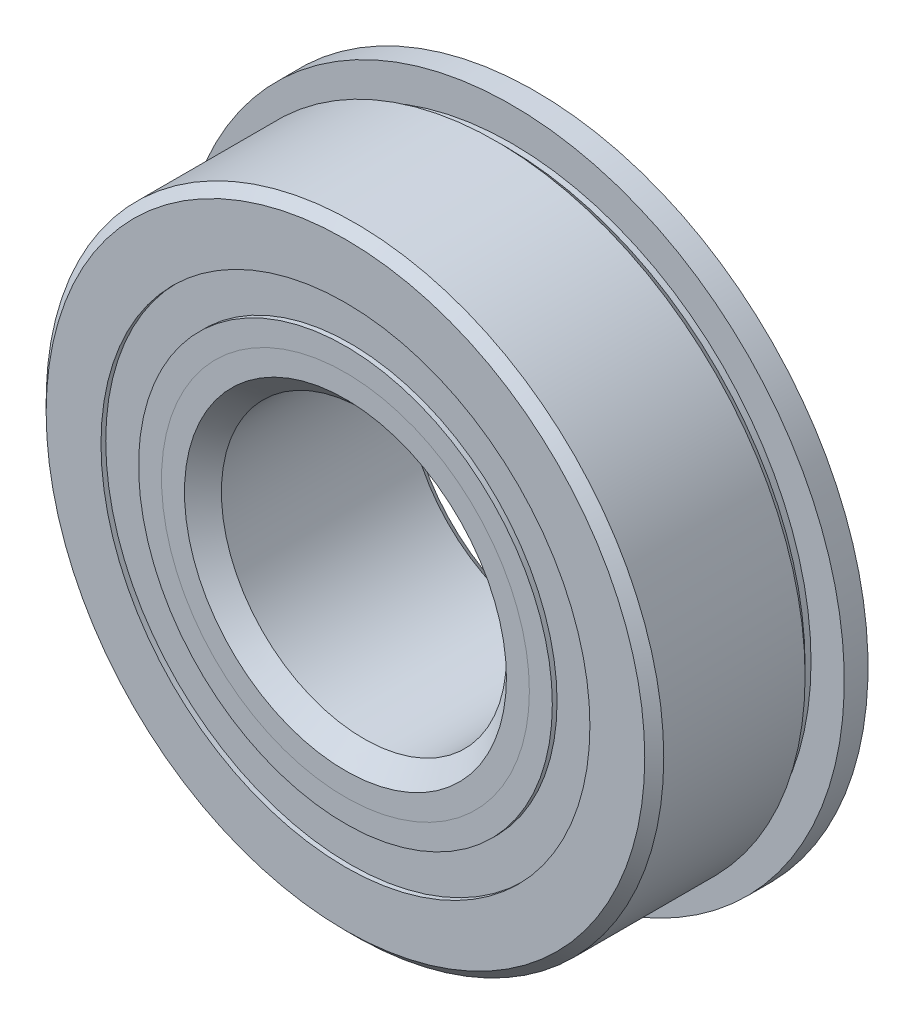
ISO-10303-21;
HEADER;
FILE_DESCRIPTION(('STEP AP214'),'2;1');
FILE_NAME('part.step','',(''),(''),'','','');
FILE_SCHEMA(('AUTOMOTIVE_DESIGN { 1 0 10303 214 1 1 1 1 }'));
ENDSEC;
DATA;
#1=APPLICATION_CONTEXT('core data for automotive mechanical design processes');
#2=APPLICATION_PROTOCOL_DEFINITION('international standard','automotive_design',2000,#1);
#3=PRODUCT_CONTEXT('',#1,'mechanical');
#4=PRODUCT('Part','Part','',(#3));
#5=PRODUCT_RELATED_PRODUCT_CATEGORY('part','',(#4));
#6=PRODUCT_DEFINITION_FORMATION('','',#4);
#7=PRODUCT_DEFINITION_CONTEXT('part definition',#1,'design');
#8=PRODUCT_DEFINITION('design','',#6,#7);
#9=PRODUCT_DEFINITION_SHAPE('','',#8);
#10=(LENGTH_UNIT() NAMED_UNIT(*) SI_UNIT(.MILLI.,.METRE.));
#11=(NAMED_UNIT(*) PLANE_ANGLE_UNIT() SI_UNIT($,.RADIAN.));
#12=(NAMED_UNIT(*) SI_UNIT($,.STERADIAN.) SOLID_ANGLE_UNIT());
#13=UNCERTAINTY_MEASURE_WITH_UNIT(LENGTH_MEASURE(1.E-05),#10,'distance_accuracy_value','');
#14=(GEOMETRIC_REPRESENTATION_CONTEXT(3) GLOBAL_UNCERTAINTY_ASSIGNED_CONTEXT((#13)) GLOBAL_UNIT_ASSIGNED_CONTEXT((#10,
#11,#12)) REPRESENTATION_CONTEXT('',''));
#15=CARTESIAN_POINT('',(0.,0.,0.));
#16=DIRECTION('',(0.,0.,1.));
#17=DIRECTION('',(1.,0.,0.));
#18=AXIS2_PLACEMENT_3D('',#15,#16,#17);
#19=CARTESIAN_POINT('',(0.,16.337293956044,-6.0325));
#20=DIRECTION('',(0.,0.,1.));
#21=DIRECTION('',(1.,0.,0.));
#22=AXIS2_PLACEMENT_3D('',#19,#20,#21);
#23=PLANE('',#22);
#24=CARTESIAN_POINT('',(0.,0.,-6.0325));
#25=DIRECTION('',(0.,0.,1.));
#26=DIRECTION('',(1.,0.,0.));
#27=AXIS2_PLACEMENT_3D('',#24,#25,#26);
#28=CIRCLE('',#27,16.337293956044);
#29=CARTESIAN_POINT('',(16.337293956044,0.,-6.0325));
#30=VERTEX_POINT('',#29);
#31=EDGE_CURVE('E57',#30,#30,#28,.T.);
#32=ORIENTED_EDGE('',*,*,#31,.F.);
#33=EDGE_LOOP('',(#32));
#34=FACE_BOUND('',#33,.T.);
#35=CARTESIAN_POINT('',(0.,0.,-6.0325));
#36=DIRECTION('',(0.,0.,1.));
#37=DIRECTION('',(1.,0.,0.));
#38=AXIS2_PLACEMENT_3D('',#35,#36,#37);
#39=CIRCLE('',#38,13.825206043956);
#40=CARTESIAN_POINT('',(13.825206043956,0.,-6.0325));
#41=VERTEX_POINT('',#40);
#42=EDGE_CURVE('E11',#41,#41,#39,.T.);
#43=ORIENTED_EDGE('',*,*,#42,.T.);
#44=EDGE_LOOP('',(#43));
#45=FACE_BOUND('',#44,.T.);
#46=ADVANCED_FACE('F43',(#34,#45),#23,.F.);
#47=CARTESIAN_POINT('',(0.,0.,6.35));
#48=DIRECTION('',(0.,0.,1.));
#49=DIRECTION('',(1.,0.,0.));
#50=AXIS2_PLACEMENT_3D('',#47,#48,#49);
#51=CYLINDRICAL_SURFACE('',#50,13.825206043956);
#52=ORIENTED_EDGE('',*,*,#42,.F.);
#53=EDGE_LOOP('',(#52));
#54=FACE_BOUND('',#53,.T.);
#55=CARTESIAN_POINT('',(0.,0.,-3.08910742628344));
#56=DIRECTION('',(0.,0.,1.));
#57=DIRECTION('',(1.,0.,0.));
#58=AXIS2_PLACEMENT_3D('',#55,#56,#57);
#59=CIRCLE('',#58,13.825206043956);
#60=CARTESIAN_POINT('',(13.825206043956,0.,-3.08910742628344));
#61=VERTEX_POINT('',#60);
#62=EDGE_CURVE('E49',#61,#61,#59,.T.);
#63=ORIENTED_EDGE('',*,*,#62,.T.);
#64=EDGE_LOOP('',(#63));
#65=FACE_BOUND('',#64,.T.);
#66=ADVANCED_FACE('F66',(#54,#65),#51,.F.);
#67=CARTESIAN_POINT('',(0.,16.337293956044,-3.08910742628344));
#68=DIRECTION('',(0.,0.,-1.));
#69=DIRECTION('',(-1.,0.,0.));
#70=AXIS2_PLACEMENT_3D('',#67,#68,#69);
#71=PLANE('',#70);
#72=ORIENTED_EDGE('',*,*,#62,.F.);
#73=EDGE_LOOP('',(#72));
#74=FACE_BOUND('',#73,.T.);
#75=CARTESIAN_POINT('',(0.,0.,-3.08910742628344));
#76=DIRECTION('',(0.,0.,1.));
#77=DIRECTION('',(1.,0.,0.));
#78=AXIS2_PLACEMENT_3D('',#75,#76,#77);
#79=CIRCLE('',#78,16.337293956044);
#80=CARTESIAN_POINT('',(16.337293956044,0.,-3.08910742628344));
#81=VERTEX_POINT('',#80);
#82=EDGE_CURVE('E53',#81,#81,#79,.T.);
#83=ORIENTED_EDGE('',*,*,#82,.T.);
#84=EDGE_LOOP('',(#83));
#85=FACE_BOUND('',#84,.T.);
#86=ADVANCED_FACE('F70',(#74,#85),#71,.F.);
#87=CARTESIAN_POINT('',(0.,0.,6.35));
#88=DIRECTION('',(0.,0.,1.));
#89=DIRECTION('',(1.,0.,0.));
#90=AXIS2_PLACEMENT_3D('',#87,#88,#89);
#91=CYLINDRICAL_SURFACE('',#90,16.337293956044);
#92=ORIENTED_EDGE('',*,*,#82,.F.);
#93=EDGE_LOOP('',(#92));
#94=FACE_BOUND('',#93,.T.);
#95=ORIENTED_EDGE('',*,*,#31,.T.);
#96=EDGE_LOOP('',(#95));
#97=FACE_BOUND('',#96,.T.);
#98=ADVANCED_FACE('F63',(#94,#97),#91,.T.);
#99=CLOSED_SHELL('',(#46,#66,#86,#98));
#100=MANIFOLD_SOLID_BREP('B2',#99);
#101=CARTESIAN_POINT('',(0.,16.337293956044,6.0325));
#102=DIRECTION('',(0.,0.,-1.));
#103=DIRECTION('',(-1.,0.,0.));
#104=AXIS2_PLACEMENT_3D('',#101,#102,#103);
#105=PLANE('',#104);
#106=CARTESIAN_POINT('',(0.,0.,6.0325));
#107=DIRECTION('',(0.,0.,1.));
#108=DIRECTION('',(1.,0.,0.));
#109=AXIS2_PLACEMENT_3D('',#106,#107,#108);
#110=CIRCLE('',#109,13.825206043956);
#111=CARTESIAN_POINT('',(13.825206043956,0.,6.0325));
#112=VERTEX_POINT('',#111);
#113=EDGE_CURVE('E42',#112,#112,#110,.T.);
#114=ORIENTED_EDGE('',*,*,#113,.F.);
#115=EDGE_LOOP('',(#114));
#116=FACE_BOUND('',#115,.T.);
#117=CARTESIAN_POINT('',(0.,0.,6.0325));
#118=DIRECTION('',(0.,0.,1.));
#119=DIRECTION('',(1.,0.,0.));
#120=AXIS2_PLACEMENT_3D('',#117,#118,#119);
#121=CIRCLE('',#120,16.337293956044);
#122=CARTESIAN_POINT('',(16.337293956044,0.,6.0325));
#123=VERTEX_POINT('',#122);
#124=EDGE_CURVE('E124',#123,#123,#121,.T.);
#125=ORIENTED_EDGE('',*,*,#124,.T.);
#126=EDGE_LOOP('',(#125));
#127=FACE_BOUND('',#126,.T.);
#128=ADVANCED_FACE('F110',(#116,#127),#105,.F.);
#129=CARTESIAN_POINT('',(0.,0.,6.35));
#130=DIRECTION('',(0.,0.,1.));
#131=DIRECTION('',(1.,0.,0.));
#132=AXIS2_PLACEMENT_3D('',#129,#130,#131);
#133=CYLINDRICAL_SURFACE('',#132,13.825206043956);
#134=CARTESIAN_POINT('',(0.,0.,3.08910742628344));
#135=DIRECTION('',(0.,0.,1.));
#136=DIRECTION('',(1.,0.,0.));
#137=AXIS2_PLACEMENT_3D('',#134,#135,#136);
#138=CIRCLE('',#137,13.825206043956);
#139=CARTESIAN_POINT('',(13.825206043956,0.,3.08910742628344));
#140=VERTEX_POINT('',#139);
#141=EDGE_CURVE('E116',#140,#140,#138,.T.);
#142=ORIENTED_EDGE('',*,*,#141,.F.);
#143=EDGE_LOOP('',(#142));
#144=FACE_BOUND('',#143,.T.);
#145=ORIENTED_EDGE('',*,*,#113,.T.);
#146=EDGE_LOOP('',(#145));
#147=FACE_BOUND('',#146,.T.);
#148=ADVANCED_FACE('F139',(#144,#147),#133,.F.);
#149=CARTESIAN_POINT('',(0.,16.337293956044,3.08910742628344));
#150=DIRECTION('',(0.,0.,1.));
#151=DIRECTION('',(1.,0.,0.));
#152=AXIS2_PLACEMENT_3D('',#149,#150,#151);
#153=PLANE('',#152);
#154=CARTESIAN_POINT('',(0.,0.,3.08910742628344));
#155=DIRECTION('',(0.,0.,1.));
#156=DIRECTION('',(1.,0.,0.));
#157=AXIS2_PLACEMENT_3D('',#154,#155,#156);
#158=CIRCLE('',#157,16.337293956044);
#159=CARTESIAN_POINT('',(16.337293956044,0.,3.08910742628344));
#160=VERTEX_POINT('',#159);
#161=EDGE_CURVE('E120',#160,#160,#158,.T.);
#162=ORIENTED_EDGE('',*,*,#161,.F.);
#163=EDGE_LOOP('',(#162));
#164=FACE_BOUND('',#163,.T.);
#165=ORIENTED_EDGE('',*,*,#141,.T.);
#166=EDGE_LOOP('',(#165));
#167=FACE_BOUND('',#166,.T.);
#168=ADVANCED_FACE('F134',(#164,#167),#153,.F.);
#169=CARTESIAN_POINT('',(0.,0.,6.35));
#170=DIRECTION('',(0.,0.,1.));
#171=DIRECTION('',(1.,0.,0.));
#172=AXIS2_PLACEMENT_3D('',#169,#170,#171);
#173=CYLINDRICAL_SURFACE('',#172,16.337293956044);
#174=ORIENTED_EDGE('',*,*,#124,.F.);
#175=EDGE_LOOP('',(#174));
#176=FACE_BOUND('',#175,.T.);
#177=ORIENTED_EDGE('',*,*,#161,.T.);
#178=EDGE_LOOP('',(#177));
#179=FACE_BOUND('',#178,.T.);
#180=ADVANCED_FACE('F131',(#176,#179),#173,.T.);
#181=CLOSED_SHELL('',(#128,#148,#168,#180));
#182=MANIFOLD_SOLID_BREP('B6',#181);
#183=CARTESIAN_POINT('',(-6.5435091405665,13.5877367390534,0.));
#184=DIRECTION('',(0.,0.,1.));
#185=DIRECTION('',(-0.433883739117546,0.900968867902425,0.));
#186=AXIS2_PLACEMENT_3D('',#183,#184,#185);
#187=SPHERICAL_SURFACE('',#186,3.08910742628344);
#188=CARTESIAN_POINT('',(-6.5435091405665,13.5877367390534,3.08910742628344));
#189=VERTEX_POINT('',#188);
#190=VERTEX_LOOP('',#189);
#191=FACE_BOUND('',#190,.T.);
#192=ADVANCED_FACE('F177',(#191),#187,.T.);
#193=CLOSED_SHELL('',(#192));
#194=MANIFOLD_SOLID_BREP('B37',#193);
#195=CARTESIAN_POINT('',(-11.7909960449709,9.40300557428217,0.));
#196=DIRECTION('',(0.,0.,1.));
#197=DIRECTION('',(-0.781831482468022,0.623489801858743,0.));
#198=AXIS2_PLACEMENT_3D('',#195,#196,#197);
#199=SPHERICAL_SURFACE('',#198,3.08910742628344);
#200=CARTESIAN_POINT('',(-11.7909960449709,9.40300557428217,3.08910742628344));
#201=VERTEX_POINT('',#200);
#202=VERTEX_LOOP('',#201);
#203=FACE_BOUND('',#202,.T.);
#204=ADVANCED_FACE('F209',(#203),#199,.T.);
#205=CLOSED_SHELL('',(#204));
#206=MANIFOLD_SOLID_BREP('B106',#205);
#207=CARTESIAN_POINT('',(-14.7031315755921,3.35589383522882,0.));
#208=DIRECTION('',(0.,0.,1.));
#209=DIRECTION('',(-0.974927912181821,0.222520933956325,0.));
#210=AXIS2_PLACEMENT_3D('',#207,#208,#209);
#211=SPHERICAL_SURFACE('',#210,3.08910742628344);
#212=CARTESIAN_POINT('',(-14.7031315755921,3.35589383522882,3.08910742628344));
#213=VERTEX_POINT('',#212);
#214=VERTEX_LOOP('',#213);
#215=FACE_BOUND('',#214,.T.);
#216=ADVANCED_FACE('F241',(#215),#211,.T.);
#217=CLOSED_SHELL('',(#216));
#218=MANIFOLD_SOLID_BREP('B173',#217);
#219=CARTESIAN_POINT('',(-14.7031315755922,-3.35589383522853,0.));
#220=DIRECTION('',(0.,0.,1.));
#221=DIRECTION('',(-0.974927912181826,-0.222520933956305,0.));
#222=AXIS2_PLACEMENT_3D('',#219,#220,#221);
#223=SPHERICAL_SURFACE('',#222,3.08910742628344);
#224=CARTESIAN_POINT('',(-14.7031315755922,-3.35589383522853,3.08910742628344));
#225=VERTEX_POINT('',#224);
#226=VERTEX_LOOP('',#225);
#227=FACE_BOUND('',#226,.T.);
#228=ADVANCED_FACE('F273',(#227),#223,.T.);
#229=CLOSED_SHELL('',(#228));
#230=MANIFOLD_SOLID_BREP('B205',#229);
#231=CARTESIAN_POINT('',(-11.7909960449711,-9.40300557428192,0.));
#232=DIRECTION('',(0.,0.,1.));
#233=DIRECTION('',(-0.781831482468035,-0.623489801858727,0.));
#234=AXIS2_PLACEMENT_3D('',#231,#232,#233);
#235=SPHERICAL_SURFACE('',#234,3.08910742628344);
#236=CARTESIAN_POINT('',(-11.7909960449711,-9.40300557428192,3.08910742628344));
#237=VERTEX_POINT('',#236);
#238=VERTEX_LOOP('',#237);
#239=FACE_BOUND('',#238,.T.);
#240=ADVANCED_FACE('F305',(#239),#235,.T.);
#241=CLOSED_SHELL('',(#240));
#242=MANIFOLD_SOLID_BREP('B237',#241);
#243=CARTESIAN_POINT('',(-6.54350914056678,-13.5877367390533,0.));
#244=DIRECTION('',(0.,0.,1.));
#245=DIRECTION('',(-0.433883739117565,-0.900968867902416,0.));
#246=AXIS2_PLACEMENT_3D('',#243,#244,#245);
#247=SPHERICAL_SURFACE('',#246,3.08910742628344);
#248=CARTESIAN_POINT('',(-6.54350914056678,-13.5877367390533,3.08910742628344));
#249=VERTEX_POINT('',#248);
#250=VERTEX_LOOP('',#249);
#251=FACE_BOUND('',#250,.T.);
#252=ADVANCED_FACE('F337',(#251),#247,.T.);
#253=CLOSED_SHELL('',(#252));
#254=MANIFOLD_SOLID_BREP('B269',#253);
#255=CARTESIAN_POINT('',(-1.05311866879462E-13,-15.08125,0.));
#256=DIRECTION('',(0.,0.,1.));
#257=DIRECTION('',(0.,-1.,0.));
#258=AXIS2_PLACEMENT_3D('',#255,#256,#257);
#259=SPHERICAL_SURFACE('',#258,3.08910742628344);
#260=CARTESIAN_POINT('',(-1.05311866879462E-13,-15.08125,3.08910742628344));
#261=VERTEX_POINT('',#260);
#262=VERTEX_LOOP('',#261);
#263=FACE_BOUND('',#262,.T.);
#264=ADVANCED_FACE('F369',(#263),#259,.T.);
#265=CLOSED_SHELL('',(#264));
#266=MANIFOLD_SOLID_BREP('B301',#265);
#267=CARTESIAN_POINT('',(6.54350914056659,-13.5877367390534,0.));
#268=DIRECTION('',(0.,0.,1.));
#269=DIRECTION('',(0.433883739117553,-0.900968867902422,0.));
#270=AXIS2_PLACEMENT_3D('',#267,#268,#269);
#271=SPHERICAL_SURFACE('',#270,3.08910742628344);
#272=CARTESIAN_POINT('',(6.54350914056659,-13.5877367390534,3.08910742628344));
#273=VERTEX_POINT('',#272);
#274=VERTEX_LOOP('',#273);
#275=FACE_BOUND('',#274,.T.);
#276=ADVANCED_FACE('F401',(#275),#271,.T.);
#277=CLOSED_SHELL('',(#276));
#278=MANIFOLD_SOLID_BREP('B333',#277);
#279=CARTESIAN_POINT('',(11.7909960449709,-9.40300557428208,0.));
#280=DIRECTION('',(0.,0.,1.));
#281=DIRECTION('',(0.781831482468027,-0.623489801858737,0.));
#282=AXIS2_PLACEMENT_3D('',#279,#280,#281);
#283=SPHERICAL_SURFACE('',#282,3.08910742628344);
#284=CARTESIAN_POINT('',(11.7909960449709,-9.40300557428208,3.08910742628344));
#285=VERTEX_POINT('',#284);
#286=VERTEX_LOOP('',#285);
#287=FACE_BOUND('',#286,.T.);
#288=ADVANCED_FACE('F433',(#287),#283,.T.);
#289=CLOSED_SHELL('',(#288));
#290=MANIFOLD_SOLID_BREP('B365',#289);
#291=CARTESIAN_POINT('',(14.7031315755921,-3.35589383522872,0.));
#292=DIRECTION('',(0.,0.,1.));
#293=DIRECTION('',(0.974927912181823,-0.222520933956318,0.));
#294=AXIS2_PLACEMENT_3D('',#291,#292,#293);
#295=SPHERICAL_SURFACE('',#294,3.08910742628344);
#296=CARTESIAN_POINT('',(14.7031315755921,-3.35589383522872,3.08910742628344));
#297=VERTEX_POINT('',#296);
#298=VERTEX_LOOP('',#297);
#299=FACE_BOUND('',#298,.T.);
#300=ADVANCED_FACE('F465',(#299),#295,.T.);
#301=CLOSED_SHELL('',(#300));
#302=MANIFOLD_SOLID_BREP('B397',#301);
#303=CARTESIAN_POINT('',(14.7031315755921,3.35589383522862,0.));
#304=DIRECTION('',(0.,0.,1.));
#305=DIRECTION('',(0.974927912181824,0.222520933956311,0.));
#306=AXIS2_PLACEMENT_3D('',#303,#304,#305);
#307=SPHERICAL_SURFACE('',#306,3.08910742628344);
#308=CARTESIAN_POINT('',(14.7031315755921,3.35589383522862,3.08910742628344));
#309=VERTEX_POINT('',#308);
#310=VERTEX_LOOP('',#309);
#311=FACE_BOUND('',#310,.T.);
#312=ADVANCED_FACE('F497',(#311),#307,.T.);
#313=CLOSED_SHELL('',(#312));
#314=MANIFOLD_SOLID_BREP('B429',#313);
#315=CARTESIAN_POINT('',(11.790996044971,9.403005574282,0.));
#316=DIRECTION('',(0.,0.,1.));
#317=DIRECTION('',(0.781831482468031,0.623489801858732,0.));
#318=AXIS2_PLACEMENT_3D('',#315,#316,#317);
#319=SPHERICAL_SURFACE('',#318,3.08910742628344);
#320=CARTESIAN_POINT('',(11.790996044971,9.403005574282,3.08910742628344));
#321=VERTEX_POINT('',#320);
#322=VERTEX_LOOP('',#321);
#323=FACE_BOUND('',#322,.T.);
#324=ADVANCED_FACE('F529',(#323),#319,.T.);
#325=CLOSED_SHELL('',(#324));
#326=MANIFOLD_SOLID_BREP('B461',#325);
#327=CARTESIAN_POINT('',(6.54350914056669,13.5877367390534,0.));
#328=DIRECTION('',(0.,0.,1.));
#329=DIRECTION('',(0.433883739117559,0.900968867902419,0.));
#330=AXIS2_PLACEMENT_3D('',#327,#328,#329);
#331=SPHERICAL_SURFACE('',#330,3.08910742628344);
#332=CARTESIAN_POINT('',(6.54350914056669,13.5877367390534,3.08910742628344));
#333=VERTEX_POINT('',#332);
#334=VERTEX_LOOP('',#333);
#335=FACE_BOUND('',#334,.T.);
#336=ADVANCED_FACE('F561',(#335),#331,.T.);
#337=CLOSED_SHELL('',(#336));
#338=MANIFOLD_SOLID_BREP('B493',#337);
#339=CARTESIAN_POINT('',(0.,15.08125,0.));
#340=DIRECTION('',(0.,0.,1.));
#341=DIRECTION('',(0.,1.,0.));
#342=AXIS2_PLACEMENT_3D('',#339,#340,#341);
#343=SPHERICAL_SURFACE('',#342,3.08910742628344);
#344=CARTESIAN_POINT('',(0.,15.08125,3.08910742628344));
#345=VERTEX_POINT('',#344);
#346=VERTEX_LOOP('',#345);
#347=FACE_BOUND('',#346,.T.);
#348=ADVANCED_FACE('F595',(#347),#343,.T.);
#349=CLOSED_SHELL('',(#348));
#350=MANIFOLD_SOLID_BREP('B525',#349);
#351=CARTESIAN_POINT('',(0.,12.2918886654072,6.35));
#352=DIRECTION('',(0.,0.,-1.));
#353=DIRECTION('',(-1.,0.,0.));
#354=AXIS2_PLACEMENT_3D('',#351,#352,#353);
#355=PLANE('',#354);
#356=CARTESIAN_POINT('',(0.,0.,6.35));
#357=DIRECTION('',(0.,0.,1.));
#358=DIRECTION('',(1.,0.,0.));
#359=AXIS2_PLACEMENT_3D('',#356,#357,#358);
#360=CIRCLE('',#359,10.7585712868583);
#361=CARTESIAN_POINT('',(10.7585712868583,0.,6.35));
#362=VERTEX_POINT('',#361);
#363=EDGE_CURVE('E649',#362,#362,#360,.T.);
#364=ORIENTED_EDGE('',*,*,#363,.F.);
#365=EDGE_LOOP('',(#364));
#366=FACE_BOUND('',#365,.T.);
#367=CARTESIAN_POINT('',(0.,0.,6.35));
#368=DIRECTION('',(0.,0.,1.));
#369=DIRECTION('',(1.,0.,0.));
#370=AXIS2_PLACEMENT_3D('',#367,#368,#369);
#371=CIRCLE('',#370,12.2918886654072);
#372=CARTESIAN_POINT('',(12.2918886654072,0.,6.35));
#373=VERTEX_POINT('',#372);
#374=EDGE_CURVE('E594',#373,#373,#371,.T.);
#375=ORIENTED_EDGE('',*,*,#374,.T.);
#376=EDGE_LOOP('',(#375));
#377=FACE_BOUND('',#376,.T.);
#378=ADVANCED_FACE('F615',(#366,#377),#355,.F.);
#379=CARTESIAN_POINT('',(0.,0.,4.81668262145112));
#380=DIRECTION('',(0.,0.,1.));
#381=DIRECTION('',(1.,0.,0.));
#382=AXIS2_PLACEMENT_3D('',#379,#380,#381);
#383=CONICAL_SURFACE('',#382,10.7585712868583,0.78539816339745);
#384=ORIENTED_EDGE('',*,*,#374,.F.);
#385=EDGE_LOOP('',(#384));
#386=FACE_BOUND('',#385,.T.);
#387=CARTESIAN_POINT('',(0.,0.,4.81668262145112));
#388=DIRECTION('',(0.,0.,1.));
#389=DIRECTION('',(1.,0.,0.));
#390=AXIS2_PLACEMENT_3D('',#387,#388,#389);
#391=CIRCLE('',#390,10.7585712868583);
#392=CARTESIAN_POINT('',(10.7585712868583,0.,4.81668262145112));
#393=VERTEX_POINT('',#392);
#394=EDGE_CURVE('E621',#393,#393,#391,.T.);
#395=ORIENTED_EDGE('',*,*,#394,.T.);
#396=EDGE_LOOP('',(#395));
#397=FACE_BOUND('',#396,.T.);
#398=ADVANCED_FACE('F656',(#386,#397),#383,.T.);
#399=CARTESIAN_POINT('',(0.,0.,6.35));
#400=DIRECTION('',(0.,0.,1.));
#401=DIRECTION('',(1.,0.,0.));
#402=AXIS2_PLACEMENT_3D('',#399,#400,#401);
#403=CYLINDRICAL_SURFACE('',#402,10.7585712868583);
#404=ORIENTED_EDGE('',*,*,#394,.F.);
#405=EDGE_LOOP('',(#404));
#406=FACE_BOUND('',#405,.T.);
#407=CARTESIAN_POINT('',(0.,0.,0.));
#408=DIRECTION('',(0.,0.,1.));
#409=DIRECTION('',(1.,0.,0.));
#410=AXIS2_PLACEMENT_3D('',#407,#408,#409);
#411=CIRCLE('',#410,10.7585712868583);
#412=CARTESIAN_POINT('',(10.7585712868583,0.,0.));
#413=VERTEX_POINT('',#412);
#414=EDGE_CURVE('E625',#413,#413,#411,.T.);
#415=ORIENTED_EDGE('',*,*,#414,.T.);
#416=EDGE_LOOP('',(#415));
#417=FACE_BOUND('',#416,.T.);
#418=ADVANCED_FACE('F660',(#406,#417),#403,.T.);
#419=CARTESIAN_POINT('',(0.,10.7585712868583,0.));
#420=DIRECTION('',(0.,0.,-1.));
#421=DIRECTION('',(-1.,0.,0.));
#422=AXIS2_PLACEMENT_3D('',#419,#420,#421);
#423=PLANE('',#422);
#424=ORIENTED_EDGE('',*,*,#414,.F.);
#425=EDGE_LOOP('',(#424));
#426=FACE_BOUND('',#425,.T.);
#427=CARTESIAN_POINT('',(0.,0.,0.));
#428=DIRECTION('',(0.,0.,1.));
#429=DIRECTION('',(1.,0.,0.));
#430=AXIS2_PLACEMENT_3D('',#427,#428,#429);
#431=CIRCLE('',#430,11.9921425737166);
#432=CARTESIAN_POINT('',(11.9921425737166,0.,0.));
#433=VERTEX_POINT('',#432);
#434=EDGE_CURVE('E629',#433,#433,#431,.T.);
#435=ORIENTED_EDGE('',*,*,#434,.T.);
#436=EDGE_LOOP('',(#435));
#437=FACE_BOUND('',#436,.T.);
#438=ADVANCED_FACE('F665',(#426,#437),#423,.F.);
#439=CARTESIAN_POINT('',(0.,0.,0.));
#440=DIRECTION('',(0.,0.,1.));
#441=DIRECTION('',(1.,0.,0.));
#442=AXIS2_PLACEMENT_3D('',#439,#440,#441);
#443=TOROIDAL_SURFACE('',#442,15.08125,3.08910742628344);
#444=ORIENTED_EDGE('',*,*,#434,.F.);
#445=EDGE_LOOP('',(#444));
#446=FACE_BOUND('',#445,.T.);
#447=CARTESIAN_POINT('',(0.,0.,-2.82222222222222));
#448=DIRECTION('',(0.,0.,1.));
#449=DIRECTION('',(1.,0.,0.));
#450=AXIS2_PLACEMENT_3D('',#447,#448,#449);
#451=CIRCLE('',#450,13.825206043956);
#452=CARTESIAN_POINT('',(13.825206043956,0.,-2.82222222222222));
#453=VERTEX_POINT('',#452);
#454=EDGE_CURVE('E634',#453,#453,#451,.T.);
#455=ORIENTED_EDGE('',*,*,#454,.T.);
#456=EDGE_LOOP('',(#455));
#457=FACE_BOUND('',#456,.T.);
#458=ADVANCED_FACE('F671',(#446,#457),#443,.F.);
#459=CARTESIAN_POINT('',(0.,0.,6.35));
#460=DIRECTION('',(0.,0.,1.));
#461=DIRECTION('',(1.,0.,0.));
#462=AXIS2_PLACEMENT_3D('',#459,#460,#461);
#463=CYLINDRICAL_SURFACE('',#462,13.825206043956);
#464=ORIENTED_EDGE('',*,*,#454,.F.);
#465=EDGE_LOOP('',(#464));
#466=FACE_BOUND('',#465,.T.);
#467=CARTESIAN_POINT('',(0.,0.,-7.9375));
#468=DIRECTION('',(0.,0.,1.));
#469=DIRECTION('',(1.,0.,0.));
#470=AXIS2_PLACEMENT_3D('',#467,#468,#469);
#471=CIRCLE('',#470,13.825206043956);
#472=CARTESIAN_POINT('',(13.825206043956,0.,-7.9375));
#473=VERTEX_POINT('',#472);
#474=EDGE_CURVE('E637',#473,#473,#471,.T.);
#475=ORIENTED_EDGE('',*,*,#474,.T.);
#476=EDGE_LOOP('',(#475));
#477=FACE_BOUND('',#476,.T.);
#478=ADVANCED_FACE('F675',(#466,#477),#463,.T.);
#479=CARTESIAN_POINT('',(0.,10.16,-7.9375));
#480=DIRECTION('',(0.,0.,1.));
#481=DIRECTION('',(1.,0.,0.));
#482=AXIS2_PLACEMENT_3D('',#479,#480,#481);
#483=PLANE('',#482);
#484=ORIENTED_EDGE('',*,*,#474,.F.);
#485=EDGE_LOOP('',(#484));
#486=FACE_BOUND('',#485,.T.);
#487=CARTESIAN_POINT('',(0.,0.,-7.9375));
#488=DIRECTION('',(0.,0.,1.));
#489=DIRECTION('',(1.,0.,0.));
#490=AXIS2_PLACEMENT_3D('',#487,#488,#489);
#491=CIRCLE('',#490,10.16);
#492=CARTESIAN_POINT('',(10.16,0.,-7.9375));
#493=VERTEX_POINT('',#492);
#494=EDGE_CURVE('E640',#493,#493,#491,.T.);
#495=ORIENTED_EDGE('',*,*,#494,.T.);
#496=EDGE_LOOP('',(#495));
#497=FACE_BOUND('',#496,.T.);
#498=ADVANCED_FACE('F679',(#486,#497),#483,.F.);
#499=CARTESIAN_POINT('',(0.,0.,-7.3025));
#500=DIRECTION('',(0.,0.,-1.));
#501=DIRECTION('',(-1.,0.,0.));
#502=AXIS2_PLACEMENT_3D('',#499,#500,#501);
#503=CONICAL_SURFACE('',#502,9.525,0.78539816339745);
#504=ORIENTED_EDGE('',*,*,#494,.F.);
#505=EDGE_LOOP('',(#504));
#506=FACE_BOUND('',#505,.T.);
#507=CARTESIAN_POINT('',(0.,0.,-7.3025));
#508=DIRECTION('',(0.,0.,1.));
#509=DIRECTION('',(1.,0.,0.));
#510=AXIS2_PLACEMENT_3D('',#507,#508,#509);
#511=CIRCLE('',#510,9.525);
#512=CARTESIAN_POINT('',(9.525,0.,-7.3025));
#513=VERTEX_POINT('',#512);
#514=EDGE_CURVE('E643',#513,#513,#511,.T.);
#515=ORIENTED_EDGE('',*,*,#514,.T.);
#516=EDGE_LOOP('',(#515));
#517=FACE_BOUND('',#516,.T.);
#518=ADVANCED_FACE('F683',(#506,#517),#503,.F.);
#519=CARTESIAN_POINT('',(0.,0.,6.35));
#520=DIRECTION('',(0.,0.,1.));
#521=DIRECTION('',(1.,0.,0.));
#522=AXIS2_PLACEMENT_3D('',#519,#520,#521);
#523=CYLINDRICAL_SURFACE('',#522,9.525);
#524=ORIENTED_EDGE('',*,*,#514,.F.);
#525=EDGE_LOOP('',(#524));
#526=FACE_BOUND('',#525,.T.);
#527=CARTESIAN_POINT('',(0.,0.,5.11642871314172));
#528=DIRECTION('',(0.,0.,1.));
#529=DIRECTION('',(1.,0.,0.));
#530=AXIS2_PLACEMENT_3D('',#527,#528,#529);
#531=CIRCLE('',#530,9.525);
#532=CARTESIAN_POINT('',(9.525,0.,5.11642871314172));
#533=VERTEX_POINT('',#532);
#534=EDGE_CURVE('E646',#533,#533,#531,.T.);
#535=ORIENTED_EDGE('',*,*,#534,.T.);
#536=EDGE_LOOP('',(#535));
#537=FACE_BOUND('',#536,.T.);
#538=ADVANCED_FACE('F687',(#526,#537),#523,.F.);
#539=CARTESIAN_POINT('',(0.,0.,6.35));
#540=DIRECTION('',(0.,0.,1.));
#541=DIRECTION('',(1.,0.,0.));
#542=AXIS2_PLACEMENT_3D('',#539,#540,#541);
#543=CONICAL_SURFACE('',#542,10.7585712868583,0.785398163397448);
#544=ORIENTED_EDGE('',*,*,#534,.F.);
#545=EDGE_LOOP('',(#544));
#546=FACE_BOUND('',#545,.T.);
#547=ORIENTED_EDGE('',*,*,#363,.T.);
#548=EDGE_LOOP('',(#547));
#549=FACE_BOUND('',#548,.T.);
#550=ADVANCED_FACE('F653',(#546,#549),#543,.F.);
#551=CLOSED_SHELL('',(#378,#398,#418,#438,#458,#478,#498,#518,#538,#550));
#552=MANIFOLD_SOLID_BREP('B557',#551);
#553=CARTESIAN_POINT('',(0.,13.825206043956,6.35));
#554=DIRECTION('',(0.,0.,-1.));
#555=DIRECTION('',(-1.,0.,0.));
#556=AXIS2_PLACEMENT_3D('',#553,#554,#555);
#557=PLANE('',#556);
#558=CARTESIAN_POINT('',(0.,0.,6.35));
#559=DIRECTION('',(0.,0.,1.));
#560=DIRECTION('',(1.,0.,0.));
#561=AXIS2_PLACEMENT_3D('',#558,#559,#560);
#562=CIRCLE('',#561,12.2918886654072);
#563=CARTESIAN_POINT('',(12.2918886654072,0.,6.35));
#564=VERTEX_POINT('',#563);
#565=EDGE_CURVE('E614',#564,#564,#562,.T.);
#566=ORIENTED_EDGE('',*,*,#565,.F.);
#567=EDGE_LOOP('',(#566));
#568=FACE_BOUND('',#567,.T.);
#569=CARTESIAN_POINT('',(0.,0.,6.35));
#570=DIRECTION('',(0.,0.,1.));
#571=DIRECTION('',(1.,0.,0.));
#572=AXIS2_PLACEMENT_3D('',#569,#570,#571);
#573=CIRCLE('',#572,13.825206043956);
#574=CARTESIAN_POINT('',(13.825206043956,0.,6.35));
#575=VERTEX_POINT('',#574);
#576=EDGE_CURVE('E795',#575,#575,#573,.T.);
#577=ORIENTED_EDGE('',*,*,#576,.T.);
#578=EDGE_LOOP('',(#577));
#579=FACE_BOUND('',#578,.T.);
#580=ADVANCED_FACE('F773',(#568,#579),#557,.F.);
#581=CARTESIAN_POINT('',(0.,0.,6.35));
#582=DIRECTION('',(0.,0.,1.));
#583=DIRECTION('',(1.,0.,0.));
#584=AXIS2_PLACEMENT_3D('',#581,#582,#583);
#585=CONICAL_SURFACE('',#584,12.2918886654072,0.78539816339745);
#586=CARTESIAN_POINT('',(0.,0.,4.81668262145112));
#587=DIRECTION('',(0.,0.,1.));
#588=DIRECTION('',(1.,0.,0.));
#589=AXIS2_PLACEMENT_3D('',#586,#587,#588);
#590=CIRCLE('',#589,10.7585712868583);
#591=CARTESIAN_POINT('',(10.7585712868583,0.,4.81668262145112));
#592=VERTEX_POINT('',#591);
#593=EDGE_CURVE('E779',#592,#592,#590,.T.);
#594=ORIENTED_EDGE('',*,*,#593,.F.);
#595=EDGE_LOOP('',(#594));
#596=FACE_BOUND('',#595,.T.);
#597=ORIENTED_EDGE('',*,*,#565,.T.);
#598=EDGE_LOOP('',(#597));
#599=FACE_BOUND('',#598,.T.);
#600=ADVANCED_FACE('F820',(#596,#599),#585,.F.);
#601=CARTESIAN_POINT('',(0.,0.,6.35));
#602=DIRECTION('',(0.,0.,1.));
#603=DIRECTION('',(1.,0.,0.));
#604=AXIS2_PLACEMENT_3D('',#601,#602,#603);
#605=CYLINDRICAL_SURFACE('',#604,10.7585712868583);
#606=CARTESIAN_POINT('',(0.,0.,0.));
#607=DIRECTION('',(0.,0.,1.));
#608=DIRECTION('',(1.,0.,0.));
#609=AXIS2_PLACEMENT_3D('',#606,#607,#608);
#610=CIRCLE('',#609,10.7585712868583);
#611=CARTESIAN_POINT('',(10.7585712868583,0.,0.));
#612=VERTEX_POINT('',#611);
#613=EDGE_CURVE('E783',#612,#612,#610,.T.);
#614=ORIENTED_EDGE('',*,*,#613,.F.);
#615=EDGE_LOOP('',(#614));
#616=FACE_BOUND('',#615,.T.);
#617=ORIENTED_EDGE('',*,*,#593,.T.);
#618=EDGE_LOOP('',(#617));
#619=FACE_BOUND('',#618,.T.);
#620=ADVANCED_FACE('F815',(#616,#619),#605,.F.);
#621=CARTESIAN_POINT('',(0.,10.7585712868583,0.));
#622=DIRECTION('',(0.,0.,1.));
#623=DIRECTION('',(1.,0.,0.));
#624=AXIS2_PLACEMENT_3D('',#621,#622,#623);
#625=PLANE('',#624);
#626=CARTESIAN_POINT('',(0.,0.,0.));
#627=DIRECTION('',(0.,0.,1.));
#628=DIRECTION('',(1.,0.,0.));
#629=AXIS2_PLACEMENT_3D('',#626,#627,#628);
#630=CIRCLE('',#629,11.9921425737166);
#631=CARTESIAN_POINT('',(11.9921425737166,0.,0.));
#632=VERTEX_POINT('',#631);
#633=EDGE_CURVE('E787',#632,#632,#630,.T.);
#634=ORIENTED_EDGE('',*,*,#633,.F.);
#635=EDGE_LOOP('',(#634));
#636=FACE_BOUND('',#635,.T.);
#637=ORIENTED_EDGE('',*,*,#613,.T.);
#638=EDGE_LOOP('',(#637));
#639=FACE_BOUND('',#638,.T.);
#640=ADVANCED_FACE('F809',(#636,#639),#625,.F.);
#641=CARTESIAN_POINT('',(0.,0.,0.));
#642=DIRECTION('',(0.,0.,1.));
#643=DIRECTION('',(1.,0.,0.));
#644=AXIS2_PLACEMENT_3D('',#641,#642,#643);
#645=TOROIDAL_SURFACE('',#644,15.08125,3.08910742628344);
#646=CARTESIAN_POINT('',(0.,0.,2.82222222222222));
#647=DIRECTION('',(0.,0.,1.));
#648=DIRECTION('',(1.,0.,0.));
#649=AXIS2_PLACEMENT_3D('',#646,#647,#648);
#650=CIRCLE('',#649,13.825206043956);
#651=CARTESIAN_POINT('',(13.825206043956,0.,2.82222222222222));
#652=VERTEX_POINT('',#651);
#653=EDGE_CURVE('E792',#652,#652,#650,.T.);
#654=ORIENTED_EDGE('',*,*,#653,.F.);
#655=EDGE_LOOP('',(#654));
#656=FACE_BOUND('',#655,.T.);
#657=ORIENTED_EDGE('',*,*,#633,.T.);
#658=EDGE_LOOP('',(#657));
#659=FACE_BOUND('',#658,.T.);
#660=ADVANCED_FACE('F803',(#656,#659),#645,.F.);
#661=CARTESIAN_POINT('',(0.,0.,6.35));
#662=DIRECTION('',(0.,0.,1.));
#663=DIRECTION('',(1.,0.,0.));
#664=AXIS2_PLACEMENT_3D('',#661,#662,#663);
#665=CYLINDRICAL_SURFACE('',#664,13.825206043956);
#666=ORIENTED_EDGE('',*,*,#576,.F.);
#667=EDGE_LOOP('',(#666));
#668=FACE_BOUND('',#667,.T.);
#669=ORIENTED_EDGE('',*,*,#653,.T.);
#670=EDGE_LOOP('',(#669));
#671=FACE_BOUND('',#670,.T.);
#672=ADVANCED_FACE('F800',(#668,#671),#665,.T.);
#673=CLOSED_SHELL('',(#580,#600,#620,#640,#660,#672));
#674=MANIFOLD_SOLID_BREP('B589',#673);
#675=CARTESIAN_POINT('',(0.,0.,6.35));
#676=DIRECTION('',(0.,0.,1.));
#677=DIRECTION('',(1.,0.,0.));
#678=AXIS2_PLACEMENT_3D('',#675,#676,#677);
#679=CYLINDRICAL_SURFACE('',#678,20.6375);
#680=CARTESIAN_POINT('',(0.,0.,5.715));
#681=DIRECTION('',(0.,0.,1.));
#682=DIRECTION('',(1.,0.,0.));
#683=AXIS2_PLACEMENT_3D('',#680,#681,#682);
#684=CIRCLE('',#683,20.6375);
#685=CARTESIAN_POINT('',(20.6375,0.,5.715));
#686=VERTEX_POINT('',#685);
#687=EDGE_CURVE('E772',#686,#686,#684,.T.);
#688=ORIENTED_EDGE('',*,*,#687,.F.);
#689=EDGE_LOOP('',(#688));
#690=FACE_BOUND('',#689,.T.);
#691=CARTESIAN_POINT('',(0.,0.,-3.730625));
#692=DIRECTION('',(0.,0.,1.));
#693=DIRECTION('',(1.,0.,0.));
#694=AXIS2_PLACEMENT_3D('',#691,#692,#693);
#695=CIRCLE('',#694,20.6375);
#696=CARTESIAN_POINT('',(20.6375,0.,-3.730625));
#697=VERTEX_POINT('',#696);
#698=EDGE_CURVE('E902',#697,#697,#695,.T.);
#699=ORIENTED_EDGE('',*,*,#698,.T.);
#700=EDGE_LOOP('',(#699));
#701=FACE_BOUND('',#700,.T.);
#702=ADVANCED_FACE('F864',(#690,#701),#679,.T.);
#703=CARTESIAN_POINT('',(0.,0.,5.715));
#704=DIRECTION('',(0.,0.,-1.));
#705=DIRECTION('',(-1.,0.,0.));
#706=AXIS2_PLACEMENT_3D('',#703,#704,#705);
#707=CONICAL_SURFACE('',#706,20.6375,0.785398163397446);
#708=CARTESIAN_POINT('',(0.,0.,6.35));
#709=DIRECTION('',(0.,0.,1.));
#710=DIRECTION('',(1.,0.,0.));
#711=AXIS2_PLACEMENT_3D('',#708,#709,#710);
#712=CIRCLE('',#711,20.0025);
#713=CARTESIAN_POINT('',(20.0025,0.,6.35));
#714=VERTEX_POINT('',#713);
#715=EDGE_CURVE('E887',#714,#714,#712,.T.);
#716=ORIENTED_EDGE('',*,*,#715,.F.);
#717=EDGE_LOOP('',(#716));
#718=FACE_BOUND('',#717,.T.);
#719=ORIENTED_EDGE('',*,*,#687,.T.);
#720=EDGE_LOOP('',(#719));
#721=FACE_BOUND('',#720,.T.);
#722=ADVANCED_FACE('F866',(#718,#721),#707,.T.);
#723=CARTESIAN_POINT('',(0.,20.0025,-6.35));
#724=DIRECTION('',(0.,0.,1.));
#725=DIRECTION('',(1.,0.,0.));
#726=AXIS2_PLACEMENT_3D('',#723,#724,#725);
#727=PLANE('',#726);
#728=CARTESIAN_POINT('',(0.,0.,-6.35));
#729=DIRECTION('',(0.,0.,1.));
#730=DIRECTION('',(1.,0.,0.));
#731=AXIS2_PLACEMENT_3D('',#728,#729,#730);
#732=CIRCLE('',#731,16.337293956044);
#733=CARTESIAN_POINT('',(16.337293956044,0.,-6.35));
#734=VERTEX_POINT('',#733);
#735=EDGE_CURVE('E871',#734,#734,#732,.T.);
#736=ORIENTED_EDGE('',*,*,#735,.T.);
#737=EDGE_LOOP('',(#736));
#738=FACE_BOUND('',#737,.T.);
#739=CARTESIAN_POINT('',(0.,0.,-6.35));
#740=DIRECTION('',(0.,0.,-1.));
#741=DIRECTION('',(-1.,0.,0.));
#742=AXIS2_PLACEMENT_3D('',#739,#740,#741);
#743=CIRCLE('',#742,22.225);
#744=CARTESIAN_POINT('',(-22.225,0.,-6.35));
#745=VERTEX_POINT('',#744);
#746=EDGE_CURVE('E890',#745,#745,#743,.T.);
#747=ORIENTED_EDGE('',*,*,#746,.T.);
#748=EDGE_LOOP('',(#747));
#749=FACE_BOUND('',#748,.T.);
#750=ADVANCED_FACE('F923',(#738,#749),#727,.F.);
#751=CARTESIAN_POINT('',(0.,0.,6.35));
#752=DIRECTION('',(0.,0.,1.));
#753=DIRECTION('',(1.,0.,0.));
#754=AXIS2_PLACEMENT_3D('',#751,#752,#753);
#755=CYLINDRICAL_SURFACE('',#754,16.337293956044);
#756=ORIENTED_EDGE('',*,*,#735,.F.);
#757=EDGE_LOOP('',(#756));
#758=FACE_BOUND('',#757,.T.);
#759=CARTESIAN_POINT('',(0.,0.,-2.82222222222222));
#760=DIRECTION('',(0.,0.,1.));
#761=DIRECTION('',(1.,0.,0.));
#762=AXIS2_PLACEMENT_3D('',#759,#760,#761);
#763=CIRCLE('',#762,16.337293956044);
#764=CARTESIAN_POINT('',(16.337293956044,0.,-2.82222222222222));
#765=VERTEX_POINT('',#764);
#766=EDGE_CURVE('E875',#765,#765,#763,.T.);
#767=ORIENTED_EDGE('',*,*,#766,.T.);
#768=EDGE_LOOP('',(#767));
#769=FACE_BOUND('',#768,.T.);
#770=ADVANCED_FACE('F928',(#758,#769),#755,.F.);
#771=CARTESIAN_POINT('',(0.,0.,0.));
#772=DIRECTION('',(0.,0.,1.));
#773=DIRECTION('',(1.,0.,0.));
#774=AXIS2_PLACEMENT_3D('',#771,#772,#773);
#775=TOROIDAL_SURFACE('',#774,15.08125,3.08910742628344);
#776=ORIENTED_EDGE('',*,*,#766,.F.);
#777=EDGE_LOOP('',(#776));
#778=FACE_BOUND('',#777,.T.);
#779=CARTESIAN_POINT('',(0.,0.,2.82222222222222));
#780=DIRECTION('',(0.,0.,1.));
#781=DIRECTION('',(1.,0.,0.));
#782=AXIS2_PLACEMENT_3D('',#779,#780,#781);
#783=CIRCLE('',#782,16.337293956044);
#784=CARTESIAN_POINT('',(16.337293956044,0.,2.82222222222222));
#785=VERTEX_POINT('',#784);
#786=EDGE_CURVE('E879',#785,#785,#783,.T.);
#787=ORIENTED_EDGE('',*,*,#786,.T.);
#788=EDGE_LOOP('',(#787));
#789=FACE_BOUND('',#788,.T.);
#790=ADVANCED_FACE('F931',(#778,#789),#775,.F.);
#791=CARTESIAN_POINT('',(0.,0.,6.35));
#792=DIRECTION('',(0.,0.,1.));
#793=DIRECTION('',(1.,0.,0.));
#794=AXIS2_PLACEMENT_3D('',#791,#792,#793);
#795=CYLINDRICAL_SURFACE('',#794,16.337293956044);
#796=ORIENTED_EDGE('',*,*,#786,.F.);
#797=EDGE_LOOP('',(#796));
#798=FACE_BOUND('',#797,.T.);
#799=CARTESIAN_POINT('',(0.,0.,6.35));
#800=DIRECTION('',(0.,0.,1.));
#801=DIRECTION('',(1.,0.,0.));
#802=AXIS2_PLACEMENT_3D('',#799,#800,#801);
#803=CIRCLE('',#802,16.337293956044);
#804=CARTESIAN_POINT('',(16.337293956044,0.,6.35));
#805=VERTEX_POINT('',#804);
#806=EDGE_CURVE('E884',#805,#805,#803,.T.);
#807=ORIENTED_EDGE('',*,*,#806,.T.);
#808=EDGE_LOOP('',(#807));
#809=FACE_BOUND('',#808,.T.);
#810=ADVANCED_FACE('F935',(#798,#809),#795,.F.);
#811=CARTESIAN_POINT('',(0.,20.0025,6.35));
#812=DIRECTION('',(0.,0.,-1.));
#813=DIRECTION('',(-1.,0.,0.));
#814=AXIS2_PLACEMENT_3D('',#811,#812,#813);
#815=PLANE('',#814);
#816=ORIENTED_EDGE('',*,*,#806,.F.);
#817=EDGE_LOOP('',(#816));
#818=FACE_BOUND('',#817,.T.);
#819=ORIENTED_EDGE('',*,*,#715,.T.);
#820=EDGE_LOOP('',(#819));
#821=FACE_BOUND('',#820,.T.);
#822=ADVANCED_FACE('F939',(#818,#821),#815,.F.);
#823=CARTESIAN_POINT('',(0.,18.169896978022,-4.7625));
#824=DIRECTION('',(0.,0.,1.));
#825=DIRECTION('',(1.,0.,0.));
#826=AXIS2_PLACEMENT_3D('',#823,#824,#825);
#827=PLANE('',#826);
#828=CARTESIAN_POINT('',(0.,0.,-4.7625));
#829=DIRECTION('',(0.,0.,-1.));
#830=DIRECTION('',(-1.,0.,0.));
#831=AXIS2_PLACEMENT_3D('',#828,#829,#830);
#832=CIRCLE('',#831,22.225);
#833=CARTESIAN_POINT('',(-22.225,0.,-4.7625));
#834=VERTEX_POINT('',#833);
#835=EDGE_CURVE('E893',#834,#834,#832,.T.);
#836=ORIENTED_EDGE('',*,*,#835,.F.);
#837=EDGE_LOOP('',(#836));
#838=FACE_BOUND('',#837,.T.);
#839=CARTESIAN_POINT('',(0.,0.,-4.7625));
#840=DIRECTION('',(0.,0.,1.));
#841=DIRECTION('',(1.,0.,0.));
#842=AXIS2_PLACEMENT_3D('',#839,#840,#841);
#843=CIRCLE('',#842,20.0025);
#844=CARTESIAN_POINT('',(20.0025,0.,-4.7625));
#845=VERTEX_POINT('',#844);
#846=EDGE_CURVE('E896',#845,#845,#843,.T.);
#847=ORIENTED_EDGE('',*,*,#846,.F.);
#848=EDGE_LOOP('',(#847));
#849=FACE_BOUND('',#848,.T.);
#850=ADVANCED_FACE('F943',(#838,#849),#827,.T.);
#851=CARTESIAN_POINT('',(0.,0.,-7.9375));
#852=DIRECTION('',(0.,0.,-1.));
#853=DIRECTION('',(-1.,0.,0.));
#854=AXIS2_PLACEMENT_3D('',#851,#852,#853);
#855=CYLINDRICAL_SURFACE('',#854,22.225);
#856=ORIENTED_EDGE('',*,*,#835,.T.);
#857=EDGE_LOOP('',(#856));
#858=FACE_BOUND('',#857,.T.);
#859=ORIENTED_EDGE('',*,*,#746,.F.);
#860=EDGE_LOOP('',(#859));
#861=FACE_BOUND('',#860,.T.);
#862=ADVANCED_FACE('F915',(#858,#861),#855,.T.);
#863=CARTESIAN_POINT('',(0.,0.,6.35));
#864=DIRECTION('',(0.,0.,1.));
#865=DIRECTION('',(1.,0.,0.));
#866=AXIS2_PLACEMENT_3D('',#863,#864,#865);
#867=CYLINDRICAL_SURFACE('',#866,20.0025);
#868=ORIENTED_EDGE('',*,*,#846,.T.);
#869=EDGE_LOOP('',(#868));
#870=FACE_BOUND('',#869,.T.);
#871=CARTESIAN_POINT('',(0.,0.,-4.365625));
#872=DIRECTION('',(0.,0.,1.));
#873=DIRECTION('',(1.,0.,0.));
#874=AXIS2_PLACEMENT_3D('',#871,#872,#873);
#875=CIRCLE('',#874,20.0025);
#876=CARTESIAN_POINT('',(20.0025,0.,-4.365625));
#877=VERTEX_POINT('',#876);
#878=EDGE_CURVE('E899',#877,#877,#875,.T.);
#879=ORIENTED_EDGE('',*,*,#878,.F.);
#880=EDGE_LOOP('',(#879));
#881=FACE_BOUND('',#880,.T.);
#882=ADVANCED_FACE('F909',(#870,#881),#867,.T.);
#883=CARTESIAN_POINT('',(0.,0.,-3.730625));
#884=DIRECTION('',(0.,0.,1.));
#885=DIRECTION('',(1.,0.,0.));
#886=AXIS2_PLACEMENT_3D('',#883,#884,#885);
#887=CONICAL_SURFACE('',#886,20.6375,0.785398163397446);
#888=ORIENTED_EDGE('',*,*,#878,.T.);
#889=EDGE_LOOP('',(#888));
#890=FACE_BOUND('',#889,.T.);
#891=ORIENTED_EDGE('',*,*,#698,.F.);
#892=EDGE_LOOP('',(#891));
#893=FACE_BOUND('',#892,.T.);
#894=ADVANCED_FACE('F907',(#890,#893),#887,.T.);
#895=CLOSED_SHELL('',(#702,#722,#750,#770,#790,#810,#822,#850,#862,#882,#894));
#896=MANIFOLD_SOLID_BREP('B609',#895);
#897=ADVANCED_BREP_SHAPE_REPRESENTATION('',(#18,#100,#182,#194,#206,#218,#230,#242,#254,#266,
#278,#290,#302,#314,#326,#338,#350,#552,#674,#896),#14);
#898=SHAPE_DEFINITION_REPRESENTATION(#9,#897);
ENDSEC;
END-ISO-10303-21;
